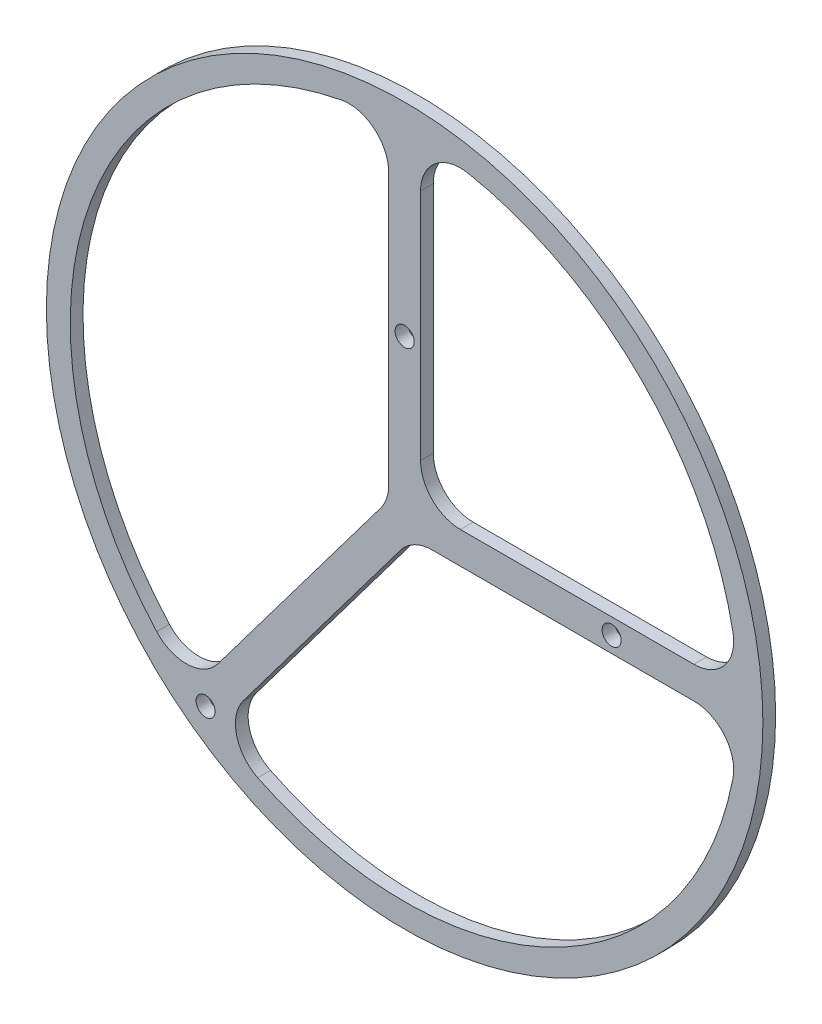
ISO-10303-21;
HEADER;
FILE_DESCRIPTION(('STEP AP214'),'2;1');
FILE_NAME('part.step','',(''),(''),'','','');
FILE_SCHEMA(('AUTOMOTIVE_DESIGN { 1 0 10303 214 1 1 1 1 }'));
ENDSEC;
DATA;
#1=APPLICATION_CONTEXT('core data for automotive mechanical design processes');
#2=APPLICATION_PROTOCOL_DEFINITION('international standard','automotive_design',2000,#1);
#3=PRODUCT_CONTEXT('',#1,'mechanical');
#4=PRODUCT('Part','Part','',(#3));
#5=PRODUCT_RELATED_PRODUCT_CATEGORY('part','',(#4));
#6=PRODUCT_DEFINITION_FORMATION('','',#4);
#7=PRODUCT_DEFINITION_CONTEXT('part definition',#1,'design');
#8=PRODUCT_DEFINITION('design','',#6,#7);
#9=PRODUCT_DEFINITION_SHAPE('','',#8);
#10=(LENGTH_UNIT() NAMED_UNIT(*) SI_UNIT(.MILLI.,.METRE.));
#11=(NAMED_UNIT(*) PLANE_ANGLE_UNIT() SI_UNIT($,.RADIAN.));
#12=(NAMED_UNIT(*) SI_UNIT($,.STERADIAN.) SOLID_ANGLE_UNIT());
#13=UNCERTAINTY_MEASURE_WITH_UNIT(LENGTH_MEASURE(1.E-05),#10,'distance_accuracy_value','');
#14=(GEOMETRIC_REPRESENTATION_CONTEXT(3) GLOBAL_UNCERTAINTY_ASSIGNED_CONTEXT((#13)) GLOBAL_UNIT_ASSIGNED_CONTEXT((#10,
#11,#12)) REPRESENTATION_CONTEXT('',''));
#15=CARTESIAN_POINT('',(0.,0.,0.));
#16=DIRECTION('',(0.,0.,1.));
#17=DIRECTION('',(1.,0.,0.));
#18=AXIS2_PLACEMENT_3D('',#15,#16,#17);
#19=CARTESIAN_POINT('',(0.,0.,1.6));
#20=DIRECTION('',(0.,0.,1.));
#21=DIRECTION('',(1.,0.,0.));
#22=AXIS2_PLACEMENT_3D('',#19,#20,#21);
#23=PLANE('',#22);
#24=DIRECTION('',(1.,0.,0.));
#25=VECTOR('',#24,1.);
#26=CARTESIAN_POINT('',(0.,2.,1.6));
#27=LINE('',#26,#25);
#28=CARTESIAN_POINT('',(7.,2.,1.6));
#29=VERTEX_POINT('',#28);
#30=CARTESIAN_POINT('',(36.3318042491699,2.,1.6));
#31=VERTEX_POINT('',#30);
#32=EDGE_CURVE('E373',#29,#31,#27,.T.);
#33=ORIENTED_EDGE('',*,*,#32,.F.);
#34=CARTESIAN_POINT('',(7.,7.,1.6));
#35=DIRECTION('',(0.,0.,1.));
#36=DIRECTION('',(1.,0.,0.));
#37=AXIS2_PLACEMENT_3D('',#34,#35,#36);
#38=CIRCLE('',#37,5.);
#39=CARTESIAN_POINT('',(2.,7.,1.6));
#40=VERTEX_POINT('',#39);
#41=EDGE_CURVE('E332',#29,#40,#38,.F.);
#42=ORIENTED_EDGE('',*,*,#41,.T.);
#43=DIRECTION('',(0.,1.,0.));
#44=VECTOR('',#43,1.);
#45=CARTESIAN_POINT('',(2.,0.,1.6));
#46=LINE('',#45,#44);
#47=CARTESIAN_POINT('',(2.,36.3318042491699,1.6));
#48=VERTEX_POINT('',#47);
#49=EDGE_CURVE('E367',#40,#48,#46,.T.);
#50=ORIENTED_EDGE('',*,*,#49,.T.);
#51=CARTESIAN_POINT('',(7.,36.3318042491699,1.6));
#52=DIRECTION('',(0.,0.,1.));
#53=DIRECTION('',(1.,0.,0.));
#54=AXIS2_PLACEMENT_3D('',#51,#52,#53);
#55=CIRCLE('',#54,5.);
#56=CARTESIAN_POINT('',(7.94594594594595,41.2415075260847,1.6));
#57=VERTEX_POINT('',#56);
#58=EDGE_CURVE('E72',#48,#57,#55,.F.);
#59=ORIENTED_EDGE('',*,*,#58,.T.);
#60=CARTESIAN_POINT('',(0.,0.,1.6));
#61=DIRECTION('',(0.,0.,1.));
#62=DIRECTION('',(1.,0.,0.));
#63=AXIS2_PLACEMENT_3D('',#60,#61,#62);
#64=CIRCLE('',#63,42.);
#65=CARTESIAN_POINT('',(41.2415075260847,7.94594594594595,1.6));
#66=VERTEX_POINT('',#65);
#67=EDGE_CURVE('E365',#66,#57,#64,.T.);
#68=ORIENTED_EDGE('',*,*,#67,.F.);
#69=CARTESIAN_POINT('',(36.3318042491699,7.,1.6));
#70=DIRECTION('',(0.,0.,1.));
#71=DIRECTION('',(1.,0.,0.));
#72=AXIS2_PLACEMENT_3D('',#69,#70,#71);
#73=CIRCLE('',#72,5.);
#74=EDGE_CURVE('E349',#66,#31,#73,.F.);
#75=ORIENTED_EDGE('',*,*,#74,.T.);
#76=EDGE_LOOP('',(#33,#42,#50,#59,#68,#75));
#77=FACE_BOUND('',#76,.T.);
#78=DIRECTION('',(0.,1.,0.));
#79=VECTOR('',#78,1.);
#80=CARTESIAN_POINT('',(-2.,0.,1.6));
#81=LINE('',#80,#79);
#82=CARTESIAN_POINT('',(-2.,2.33961256365898,1.6));
#83=VERTEX_POINT('',#82);
#84=CARTESIAN_POINT('',(-2.,36.3318042491699,1.6));
#85=VERTEX_POINT('',#84);
#86=EDGE_CURVE('E387',#83,#85,#81,.T.);
#87=ORIENTED_EDGE('',*,*,#86,.F.);
#88=CARTESIAN_POINT('',(-7.,2.33961256365898,1.6));
#89=DIRECTION('',(0.,0.,1.));
#90=DIRECTION('',(1.,0.,0.));
#91=AXIS2_PLACEMENT_3D('',#88,#89,#90);
#92=CIRCLE('',#91,5.);
#93=CARTESIAN_POINT('',(-3.0048478827538,-0.666840422845746,1.6));
#94=VERTEX_POINT('',#93);
#95=EDGE_CURVE('E326',#83,#94,#92,.F.);
#96=ORIENTED_EDGE('',*,*,#95,.T.);
#97=DIRECTION('',(-0.601290597300945,-0.799030423449241,0.));
#98=VECTOR('',#97,1.);
#99=CARTESIAN_POINT('',(-1.59806084689847,1.20258119460188,1.6));
#100=LINE('',#99,#98);
#101=CARTESIAN_POINT('',(-23.4440331249029,-27.8276357392873,1.6));
#102=VERTEX_POINT('',#101);
#103=EDGE_CURVE('E479',#94,#102,#100,.T.);
#104=ORIENTED_EDGE('',*,*,#103,.T.);
#105=CARTESIAN_POINT('',(-27.4391852421491,-24.8211827527825,1.6));
#106=DIRECTION('',(0.,0.,1.));
#107=DIRECTION('',(1.,0.,0.));
#108=AXIS2_PLACEMENT_3D('',#105,#106,#107);
#109=CIRCLE('',#108,5.);
#110=CARTESIAN_POINT('',(-31.1471832478449,-28.1753966382937,1.6));
#111=VERTEX_POINT('',#110);
#112=EDGE_CURVE('E320',#102,#111,#109,.F.);
#113=ORIENTED_EDGE('',*,*,#112,.T.);
#114=CARTESIAN_POINT('',(0.,0.,1.6));
#115=DIRECTION('',(0.,0.,1.));
#116=DIRECTION('',(1.,0.,0.));
#117=AXIS2_PLACEMENT_3D('',#114,#115,#116);
#118=CIRCLE('',#117,42.);
#119=CARTESIAN_POINT('',(-7.94594594594595,41.2415075260847,1.6));
#120=VERTEX_POINT('',#119);
#121=EDGE_CURVE('E392',#120,#111,#118,.T.);
#122=ORIENTED_EDGE('',*,*,#121,.F.);
#123=CARTESIAN_POINT('',(-7.,36.3318042491699,1.6));
#124=DIRECTION('',(0.,0.,1.));
#125=DIRECTION('',(1.,0.,0.));
#126=AXIS2_PLACEMENT_3D('',#123,#124,#125);
#127=CIRCLE('',#126,5.);
#128=EDGE_CURVE('E354',#120,#85,#127,.F.);
#129=ORIENTED_EDGE('',*,*,#128,.T.);
#130=EDGE_LOOP('',(#87,#96,#104,#113,#122,#129));
#131=FACE_BOUND('',#130,.T.);
#132=DIRECTION('',(-0.601290597300924,-0.799030423449256,0.));
#133=VECTOR('',#132,1.);
#134=CARTESIAN_POINT('',(1.59806084689766,-1.20258119460121,1.6));
#135=LINE('',#134,#133);
#136=CARTESIAN_POINT('',(-0.50221150198858,-3.99354701349538,1.6));
#137=VERTEX_POINT('',#136);
#138=CARTESIAN_POINT('',(-20.2479114311061,-30.2327981284911,1.6));
#139=VERTEX_POINT('',#138);
#140=EDGE_CURVE('E221',#137,#139,#135,.T.);
#141=ORIENTED_EDGE('',*,*,#140,.F.);
#142=CARTESIAN_POINT('',(3.4929406152577,-7.,1.6));
#143=DIRECTION('',(0.,0.,1.));
#144=DIRECTION('',(1.,0.,0.));
#145=AXIS2_PLACEMENT_3D('',#142,#143,#144);
#146=CIRCLE('',#145,5.);
#147=CARTESIAN_POINT('',(3.4929406152577,-2.,1.6));
#148=VERTEX_POINT('',#147);
#149=EDGE_CURVE('E338',#137,#148,#146,.F.);
#150=ORIENTED_EDGE('',*,*,#149,.T.);
#151=DIRECTION('',(1.,0.,0.));
#152=VECTOR('',#151,1.);
#153=CARTESIAN_POINT('',(0.,-2.,1.6));
#154=LINE('',#153,#152);
#155=CARTESIAN_POINT('',(36.3318042491699,-2.,1.6));
#156=VERTEX_POINT('',#155);
#157=EDGE_CURVE('E220',#148,#156,#154,.T.);
#158=ORIENTED_EDGE('',*,*,#157,.T.);
#159=CARTESIAN_POINT('',(36.3318042491699,-7.,1.6));
#160=DIRECTION('',(0.,0.,1.));
#161=DIRECTION('',(1.,0.,0.));
#162=AXIS2_PLACEMENT_3D('',#159,#160,#161);
#163=CIRCLE('',#162,5.);
#164=CARTESIAN_POINT('',(41.2415075260847,-7.94594594594595,1.6));
#165=VERTEX_POINT('',#164);
#166=EDGE_CURVE('E218',#156,#165,#163,.F.);
#167=ORIENTED_EDGE('',*,*,#166,.T.);
#168=CARTESIAN_POINT('',(0.,0.,1.6));
#169=DIRECTION('',(0.,0.,1.));
#170=DIRECTION('',(1.,0.,0.));
#171=AXIS2_PLACEMENT_3D('',#168,#169,#170);
#172=CIRCLE('',#171,42.);
#173=CARTESIAN_POINT('',(-18.4490781400571,-37.7310418062113,1.6));
#174=VERTEX_POINT('',#173);
#175=EDGE_CURVE('E208',#174,#165,#172,.T.);
#176=ORIENTED_EDGE('',*,*,#175,.F.);
#177=CARTESIAN_POINT('',(-16.2527593138598,-33.2392511149957,1.6));
#178=DIRECTION('',(0.,0.,1.));
#179=DIRECTION('',(1.,0.,0.));
#180=AXIS2_PLACEMENT_3D('',#177,#178,#179);
#181=CIRCLE('',#180,5.);
#182=EDGE_CURVE('E190',#174,#139,#181,.F.);
#183=ORIENTED_EDGE('',*,*,#182,.T.);
#184=EDGE_LOOP('',(#141,#150,#158,#167,#176,#183));
#185=FACE_BOUND('',#184,.T.);
#186=CARTESIAN_POINT('',(0.,0.,1.6));
#187=DIRECTION('',(0.,0.,1.));
#188=DIRECTION('',(1.,0.,0.));
#189=AXIS2_PLACEMENT_3D('',#186,#187,#188);
#190=CIRCLE('',#189,45.);
#191=CARTESIAN_POINT('',(45.,0.,1.6));
#192=VERTEX_POINT('',#191);
#193=EDGE_CURVE('E257',#192,#192,#190,.T.);
#194=ORIENTED_EDGE('',*,*,#193,.T.);
#195=EDGE_LOOP('',(#194));
#196=FACE_BOUND('',#195,.T.);
#197=CARTESIAN_POINT('',(-25.,-33.2214750669603,1.6));
#198=DIRECTION('',(0.,0.,1.));
#199=DIRECTION('',(1.,0.,0.));
#200=AXIS2_PLACEMENT_3D('',#197,#198,#199);
#201=CIRCLE('',#200,1.2);
#202=CARTESIAN_POINT('',(-23.8,-33.2214750669603,1.6));
#203=VERTEX_POINT('',#202);
#204=EDGE_CURVE('E252',#203,#203,#201,.F.);
#205=ORIENTED_EDGE('',*,*,#204,.T.);
#206=EDGE_LOOP('',(#205));
#207=FACE_BOUND('',#206,.T.);
#208=CARTESIAN_POINT('',(0.,19.5,1.6));
#209=DIRECTION('',(0.,0.,1.));
#210=DIRECTION('',(1.,0.,0.));
#211=AXIS2_PLACEMENT_3D('',#208,#209,#210);
#212=CIRCLE('',#211,1.2);
#213=CARTESIAN_POINT('',(1.2,19.5,1.6));
#214=VERTEX_POINT('',#213);
#215=EDGE_CURVE('E244',#214,#214,#212,.F.);
#216=ORIENTED_EDGE('',*,*,#215,.T.);
#217=EDGE_LOOP('',(#216));
#218=FACE_BOUND('',#217,.T.);
#219=CARTESIAN_POINT('',(26.,0.,1.6));
#220=DIRECTION('',(0.,0.,1.));
#221=DIRECTION('',(1.,0.,0.));
#222=AXIS2_PLACEMENT_3D('',#219,#220,#221);
#223=CIRCLE('',#222,1.2);
#224=CARTESIAN_POINT('',(27.2,0.,1.6));
#225=VERTEX_POINT('',#224);
#226=EDGE_CURVE('E235',#225,#225,#223,.F.);
#227=ORIENTED_EDGE('',*,*,#226,.T.);
#228=EDGE_LOOP('',(#227));
#229=FACE_BOUND('',#228,.T.);
#230=ADVANCED_FACE('F63',(#77,#131,#185,#196,#207,#218,#229),#23,.T.);
#231=CARTESIAN_POINT('',(0.,0.,1.6));
#232=DIRECTION('',(0.,0.,-1.));
#233=DIRECTION('',(-1.,0.,0.));
#234=AXIS2_PLACEMENT_3D('',#231,#232,#233);
#235=CYLINDRICAL_SURFACE('',#234,45.);
#236=ORIENTED_EDGE('',*,*,#193,.F.);
#237=EDGE_LOOP('',(#236));
#238=FACE_BOUND('',#237,.T.);
#239=CARTESIAN_POINT('',(0.,0.,0.));
#240=DIRECTION('',(0.,0.,1.));
#241=DIRECTION('',(1.,0.,0.));
#242=AXIS2_PLACEMENT_3D('',#239,#240,#241);
#243=CIRCLE('',#242,45.);
#244=CARTESIAN_POINT('',(45.,0.,0.));
#245=VERTEX_POINT('',#244);
#246=EDGE_CURVE('E256',#245,#245,#243,.T.);
#247=ORIENTED_EDGE('',*,*,#246,.T.);
#248=EDGE_LOOP('',(#247));
#249=FACE_BOUND('',#248,.T.);
#250=ADVANCED_FACE('F440',(#238,#249),#235,.T.);
#251=CARTESIAN_POINT('',(0.,0.,0.));
#252=DIRECTION('',(0.,0.,1.));
#253=DIRECTION('',(1.,0.,0.));
#254=AXIS2_PLACEMENT_3D('',#251,#252,#253);
#255=PLANE('',#254);
#256=DIRECTION('',(0.,1.,0.));
#257=VECTOR('',#256,1.);
#258=CARTESIAN_POINT('',(2.,0.,0.));
#259=LINE('',#258,#257);
#260=CARTESIAN_POINT('',(2.,7.,0.));
#261=VERTEX_POINT('',#260);
#262=CARTESIAN_POINT('',(2.,36.3318042491699,0.));
#263=VERTEX_POINT('',#262);
#264=EDGE_CURVE('E380',#261,#263,#259,.T.);
#265=ORIENTED_EDGE('',*,*,#264,.F.);
#266=CARTESIAN_POINT('',(7.,7.,0.));
#267=DIRECTION('',(0.,0.,1.));
#268=DIRECTION('',(1.,0.,0.));
#269=AXIS2_PLACEMENT_3D('',#266,#267,#268);
#270=CIRCLE('',#269,5.);
#271=CARTESIAN_POINT('',(7.,2.,0.));
#272=VERTEX_POINT('',#271);
#273=EDGE_CURVE('E335',#261,#272,#270,.T.);
#274=ORIENTED_EDGE('',*,*,#273,.T.);
#275=DIRECTION('',(1.,0.,0.));
#276=VECTOR('',#275,1.);
#277=CARTESIAN_POINT('',(0.,2.,0.));
#278=LINE('',#277,#276);
#279=CARTESIAN_POINT('',(36.3318042491699,2.,0.));
#280=VERTEX_POINT('',#279);
#281=EDGE_CURVE('E394',#272,#280,#278,.T.);
#282=ORIENTED_EDGE('',*,*,#281,.T.);
#283=CARTESIAN_POINT('',(36.3318042491699,7.,0.));
#284=DIRECTION('',(0.,0.,1.));
#285=DIRECTION('',(1.,0.,0.));
#286=AXIS2_PLACEMENT_3D('',#283,#284,#285);
#287=CIRCLE('',#286,5.);
#288=CARTESIAN_POINT('',(41.2415075260847,7.94594594594595,0.));
#289=VERTEX_POINT('',#288);
#290=EDGE_CURVE('E86',#280,#289,#287,.T.);
#291=ORIENTED_EDGE('',*,*,#290,.T.);
#292=CARTESIAN_POINT('',(0.,0.,0.));
#293=DIRECTION('',(0.,0.,1.));
#294=DIRECTION('',(1.,0.,0.));
#295=AXIS2_PLACEMENT_3D('',#292,#293,#294);
#296=CIRCLE('',#295,42.);
#297=CARTESIAN_POINT('',(7.94594594594595,41.2415075260847,0.));
#298=VERTEX_POINT('',#297);
#299=EDGE_CURVE('E382',#289,#298,#296,.T.);
#300=ORIENTED_EDGE('',*,*,#299,.T.);
#301=CARTESIAN_POINT('',(7.,36.3318042491699,0.));
#302=DIRECTION('',(0.,0.,1.));
#303=DIRECTION('',(1.,0.,0.));
#304=AXIS2_PLACEMENT_3D('',#301,#302,#303);
#305=CIRCLE('',#304,5.);
#306=EDGE_CURVE('E12',#298,#263,#305,.T.);
#307=ORIENTED_EDGE('',*,*,#306,.T.);
#308=EDGE_LOOP('',(#265,#274,#282,#291,#300,#307));
#309=FACE_BOUND('',#308,.T.);
#310=DIRECTION('',(-0.601290597300945,-0.799030423449241,0.));
#311=VECTOR('',#310,1.);
#312=CARTESIAN_POINT('',(-1.59806084689847,1.20258119460188,0.));
#313=LINE('',#312,#311);
#314=CARTESIAN_POINT('',(-3.0048478827538,-0.666840422845746,0.));
#315=VERTEX_POINT('',#314);
#316=CARTESIAN_POINT('',(-23.4440331249029,-27.8276357392873,0.));
#317=VERTEX_POINT('',#316);
#318=EDGE_CURVE('E227',#315,#317,#313,.T.);
#319=ORIENTED_EDGE('',*,*,#318,.F.);
#320=CARTESIAN_POINT('',(-7.,2.33961256365898,0.));
#321=DIRECTION('',(0.,0.,1.));
#322=DIRECTION('',(1.,0.,0.));
#323=AXIS2_PLACEMENT_3D('',#320,#321,#322);
#324=CIRCLE('',#323,5.);
#325=CARTESIAN_POINT('',(-2.,2.33961256365898,0.));
#326=VERTEX_POINT('',#325);
#327=EDGE_CURVE('E329',#315,#326,#324,.T.);
#328=ORIENTED_EDGE('',*,*,#327,.T.);
#329=DIRECTION('',(0.,1.,0.));
#330=VECTOR('',#329,1.);
#331=CARTESIAN_POINT('',(-2.,0.,0.));
#332=LINE('',#331,#330);
#333=CARTESIAN_POINT('',(-2.,36.3318042491699,0.));
#334=VERTEX_POINT('',#333);
#335=EDGE_CURVE('E470',#326,#334,#332,.T.);
#336=ORIENTED_EDGE('',*,*,#335,.T.);
#337=CARTESIAN_POINT('',(-7.,36.3318042491699,0.));
#338=DIRECTION('',(0.,0.,1.));
#339=DIRECTION('',(1.,0.,0.));
#340=AXIS2_PLACEMENT_3D('',#337,#338,#339);
#341=CIRCLE('',#340,5.);
#342=CARTESIAN_POINT('',(-7.94594594594595,41.2415075260847,0.));
#343=VERTEX_POINT('',#342);
#344=EDGE_CURVE('E357',#334,#343,#341,.T.);
#345=ORIENTED_EDGE('',*,*,#344,.T.);
#346=CARTESIAN_POINT('',(0.,0.,0.));
#347=DIRECTION('',(0.,0.,1.));
#348=DIRECTION('',(1.,0.,0.));
#349=AXIS2_PLACEMENT_3D('',#346,#347,#348);
#350=CIRCLE('',#349,42.);
#351=CARTESIAN_POINT('',(-31.1471832478449,-28.1753966382937,0.));
#352=VERTEX_POINT('',#351);
#353=EDGE_CURVE('E478',#343,#352,#350,.T.);
#354=ORIENTED_EDGE('',*,*,#353,.T.);
#355=CARTESIAN_POINT('',(-27.4391852421491,-24.8211827527825,0.));
#356=DIRECTION('',(0.,0.,1.));
#357=DIRECTION('',(1.,0.,0.));
#358=AXIS2_PLACEMENT_3D('',#355,#356,#357);
#359=CIRCLE('',#358,5.);
#360=EDGE_CURVE('E323',#352,#317,#359,.T.);
#361=ORIENTED_EDGE('',*,*,#360,.T.);
#362=EDGE_LOOP('',(#319,#328,#336,#345,#354,#361));
#363=FACE_BOUND('',#362,.T.);
#364=DIRECTION('',(1.,0.,0.));
#365=VECTOR('',#364,1.);
#366=CARTESIAN_POINT('',(0.,-2.,0.));
#367=LINE('',#366,#365);
#368=CARTESIAN_POINT('',(3.4929406152577,-2.,0.));
#369=VERTEX_POINT('',#368);
#370=CARTESIAN_POINT('',(36.3318042491699,-2.,0.));
#371=VERTEX_POINT('',#370);
#372=EDGE_CURVE('E236',#369,#371,#367,.T.);
#373=ORIENTED_EDGE('',*,*,#372,.F.);
#374=CARTESIAN_POINT('',(3.4929406152577,-7.,0.));
#375=DIRECTION('',(0.,0.,1.));
#376=DIRECTION('',(1.,0.,0.));
#377=AXIS2_PLACEMENT_3D('',#374,#375,#376);
#378=CIRCLE('',#377,5.);
#379=CARTESIAN_POINT('',(-0.50221150198858,-3.99354701349538,0.));
#380=VERTEX_POINT('',#379);
#381=EDGE_CURVE('E341',#369,#380,#378,.T.);
#382=ORIENTED_EDGE('',*,*,#381,.T.);
#383=DIRECTION('',(-0.601290597300924,-0.799030423449256,0.));
#384=VECTOR('',#383,1.);
#385=CARTESIAN_POINT('',(1.59806084689766,-1.20258119460121,0.));
#386=LINE('',#385,#384);
#387=CARTESIAN_POINT('',(-20.2479114311061,-30.2327981284911,0.));
#388=VERTEX_POINT('',#387);
#389=EDGE_CURVE('E225',#380,#388,#386,.T.);
#390=ORIENTED_EDGE('',*,*,#389,.T.);
#391=CARTESIAN_POINT('',(-16.2527593138598,-33.2392511149957,0.));
#392=DIRECTION('',(0.,0.,1.));
#393=DIRECTION('',(1.,0.,0.));
#394=AXIS2_PLACEMENT_3D('',#391,#392,#393);
#395=CIRCLE('',#394,5.);
#396=CARTESIAN_POINT('',(-18.4490781400571,-37.7310418062113,0.));
#397=VERTEX_POINT('',#396);
#398=EDGE_CURVE('E201',#388,#397,#395,.T.);
#399=ORIENTED_EDGE('',*,*,#398,.T.);
#400=CARTESIAN_POINT('',(0.,0.,0.));
#401=DIRECTION('',(0.,0.,1.));
#402=DIRECTION('',(1.,0.,0.));
#403=AXIS2_PLACEMENT_3D('',#400,#401,#402);
#404=CIRCLE('',#403,42.);
#405=CARTESIAN_POINT('',(41.2415075260847,-7.94594594594595,0.));
#406=VERTEX_POINT('',#405);
#407=EDGE_CURVE('E211',#397,#406,#404,.T.);
#408=ORIENTED_EDGE('',*,*,#407,.T.);
#409=CARTESIAN_POINT('',(36.3318042491699,-7.,0.));
#410=DIRECTION('',(0.,0.,1.));
#411=DIRECTION('',(1.,0.,0.));
#412=AXIS2_PLACEMENT_3D('',#409,#410,#411);
#413=CIRCLE('',#412,5.);
#414=EDGE_CURVE('E346',#406,#371,#413,.T.);
#415=ORIENTED_EDGE('',*,*,#414,.T.);
#416=EDGE_LOOP('',(#373,#382,#390,#399,#408,#415));
#417=FACE_BOUND('',#416,.T.);
#418=CARTESIAN_POINT('',(26.,0.,0.));
#419=DIRECTION('',(0.,0.,-1.));
#420=DIRECTION('',(-1.,0.,0.));
#421=AXIS2_PLACEMENT_3D('',#418,#419,#420);
#422=CIRCLE('',#421,1.2);
#423=CARTESIAN_POINT('',(24.8,0.,0.));
#424=VERTEX_POINT('',#423);
#425=EDGE_CURVE('E231',#424,#424,#422,.T.);
#426=ORIENTED_EDGE('',*,*,#425,.F.);
#427=EDGE_LOOP('',(#426));
#428=FACE_BOUND('',#427,.T.);
#429=CARTESIAN_POINT('',(0.,19.5,0.));
#430=DIRECTION('',(0.,0.,-1.));
#431=DIRECTION('',(-1.,0.,0.));
#432=AXIS2_PLACEMENT_3D('',#429,#430,#431);
#433=CIRCLE('',#432,1.2);
#434=CARTESIAN_POINT('',(-1.2,19.5,0.));
#435=VERTEX_POINT('',#434);
#436=EDGE_CURVE('E240',#435,#435,#433,.T.);
#437=ORIENTED_EDGE('',*,*,#436,.F.);
#438=EDGE_LOOP('',(#437));
#439=FACE_BOUND('',#438,.T.);
#440=CARTESIAN_POINT('',(-25.,-33.2214750669603,0.));
#441=DIRECTION('',(0.,0.,-1.));
#442=DIRECTION('',(-1.,0.,0.));
#443=AXIS2_PLACEMENT_3D('',#440,#441,#442);
#444=CIRCLE('',#443,1.2);
#445=CARTESIAN_POINT('',(-26.2,-33.2214750669603,0.));
#446=VERTEX_POINT('',#445);
#447=EDGE_CURVE('E248',#446,#446,#444,.T.);
#448=ORIENTED_EDGE('',*,*,#447,.F.);
#449=EDGE_LOOP('',(#448));
#450=FACE_BOUND('',#449,.T.);
#451=ORIENTED_EDGE('',*,*,#246,.F.);
#452=EDGE_LOOP('',(#451));
#453=FACE_BOUND('',#452,.T.);
#454=ADVANCED_FACE('F378',(#309,#363,#417,#428,#439,#450,#453),#255,.F.);
#455=CARTESIAN_POINT('',(-25.,-33.2214750669603,0.));
#456=DIRECTION('',(0.,0.,-1.));
#457=DIRECTION('',(-1.,0.,0.));
#458=AXIS2_PLACEMENT_3D('',#455,#456,#457);
#459=CYLINDRICAL_SURFACE('',#458,1.2);
#460=ORIENTED_EDGE('',*,*,#204,.F.);
#461=EDGE_LOOP('',(#460));
#462=FACE_BOUND('',#461,.T.);
#463=ORIENTED_EDGE('',*,*,#447,.T.);
#464=EDGE_LOOP('',(#463));
#465=FACE_BOUND('',#464,.T.);
#466=ADVANCED_FACE('F451',(#462,#465),#459,.F.);
#467=CARTESIAN_POINT('',(0.,19.5,0.));
#468=DIRECTION('',(0.,0.,-1.));
#469=DIRECTION('',(-1.,0.,0.));
#470=AXIS2_PLACEMENT_3D('',#467,#468,#469);
#471=CYLINDRICAL_SURFACE('',#470,1.2);
#472=ORIENTED_EDGE('',*,*,#215,.F.);
#473=EDGE_LOOP('',(#472));
#474=FACE_BOUND('',#473,.T.);
#475=ORIENTED_EDGE('',*,*,#436,.T.);
#476=EDGE_LOOP('',(#475));
#477=FACE_BOUND('',#476,.T.);
#478=ADVANCED_FACE('F519',(#474,#477),#471,.F.);
#479=CARTESIAN_POINT('',(26.,0.,0.));
#480=DIRECTION('',(0.,0.,-1.));
#481=DIRECTION('',(-1.,0.,0.));
#482=AXIS2_PLACEMENT_3D('',#479,#480,#481);
#483=CYLINDRICAL_SURFACE('',#482,1.2);
#484=ORIENTED_EDGE('',*,*,#226,.F.);
#485=EDGE_LOOP('',(#484));
#486=FACE_BOUND('',#485,.T.);
#487=ORIENTED_EDGE('',*,*,#425,.T.);
#488=EDGE_LOOP('',(#487));
#489=FACE_BOUND('',#488,.T.);
#490=ADVANCED_FACE('F518',(#486,#489),#483,.F.);
#491=CARTESIAN_POINT('',(1.59806084689766,-1.20258119460121,0.));
#492=DIRECTION('',(-0.799030423449256,0.601290597300924,0.));
#493=DIRECTION('',(-0.601290597300924,-0.799030423449256,0.));
#494=AXIS2_PLACEMENT_3D('',#491,#492,#493);
#495=PLANE('',#494);
#496=ORIENTED_EDGE('',*,*,#140,.T.);
#497=DIRECTION('',(0.,0.,-1.));
#498=VECTOR('',#497,1.);
#499=CARTESIAN_POINT('',(-20.2479114311061,-30.2327981284911,0.));
#500=LINE('',#499,#498);
#501=EDGE_CURVE('E195',#139,#388,#500,.T.);
#502=ORIENTED_EDGE('',*,*,#501,.T.);
#503=ORIENTED_EDGE('',*,*,#389,.F.);
#504=DIRECTION('',(0.,0.,1.));
#505=VECTOR('',#504,1.);
#506=CARTESIAN_POINT('',(-0.50221150198858,-3.99354701349538,0.));
#507=LINE('',#506,#505);
#508=EDGE_CURVE('E213',#380,#137,#507,.T.);
#509=ORIENTED_EDGE('',*,*,#508,.T.);
#510=EDGE_LOOP('',(#496,#502,#503,#509));
#511=FACE_BOUND('',#510,.T.);
#512=ADVANCED_FACE('F424',(#511),#495,.F.);
#513=CARTESIAN_POINT('',(0.,-2.,0.));
#514=DIRECTION('',(0.,-1.,0.));
#515=DIRECTION('',(0.,0.,-1.));
#516=AXIS2_PLACEMENT_3D('',#513,#514,#515);
#517=PLANE('',#516);
#518=ORIENTED_EDGE('',*,*,#157,.F.);
#519=DIRECTION('',(0.,0.,1.));
#520=VECTOR('',#519,1.);
#521=CARTESIAN_POINT('',(3.4929406152577,-2.,0.));
#522=LINE('',#521,#520);
#523=EDGE_CURVE('E310',#148,#369,#522,.F.);
#524=ORIENTED_EDGE('',*,*,#523,.T.);
#525=ORIENTED_EDGE('',*,*,#372,.T.);
#526=DIRECTION('',(0.,0.,1.));
#527=VECTOR('',#526,1.);
#528=CARTESIAN_POINT('',(36.3318042491699,-2.,0.));
#529=LINE('',#528,#527);
#530=EDGE_CURVE('E306',#371,#156,#529,.T.);
#531=ORIENTED_EDGE('',*,*,#530,.T.);
#532=EDGE_LOOP('',(#518,#524,#525,#531));
#533=FACE_BOUND('',#532,.T.);
#534=ADVANCED_FACE('F413',(#533),#517,.T.);
#535=CARTESIAN_POINT('',(0.,0.,0.));
#536=DIRECTION('',(0.,0.,1.));
#537=DIRECTION('',(1.,0.,0.));
#538=AXIS2_PLACEMENT_3D('',#535,#536,#537);
#539=CYLINDRICAL_SURFACE('',#538,42.);
#540=ORIENTED_EDGE('',*,*,#407,.F.);
#541=DIRECTION('',(0.,0.,1.));
#542=VECTOR('',#541,1.);
#543=CARTESIAN_POINT('',(-18.4490781400571,-37.7310418062113,0.));
#544=LINE('',#543,#542);
#545=EDGE_CURVE('E194',#397,#174,#544,.T.);
#546=ORIENTED_EDGE('',*,*,#545,.T.);
#547=ORIENTED_EDGE('',*,*,#175,.T.);
#548=DIRECTION('',(0.,0.,1.));
#549=VECTOR('',#548,1.);
#550=CARTESIAN_POINT('',(41.2415075260847,-7.94594594594595,0.));
#551=LINE('',#550,#549);
#552=EDGE_CURVE('E214',#165,#406,#551,.F.);
#553=ORIENTED_EDGE('',*,*,#552,.T.);
#554=EDGE_LOOP('',(#540,#546,#547,#553));
#555=FACE_BOUND('',#554,.T.);
#556=ADVANCED_FACE('F207',(#555),#539,.F.);
#557=CARTESIAN_POINT('',(-2.,0.,0.));
#558=DIRECTION('',(1.,0.,0.));
#559=DIRECTION('',(0.,0.,-1.));
#560=AXIS2_PLACEMENT_3D('',#557,#558,#559);
#561=PLANE('',#560);
#562=ORIENTED_EDGE('',*,*,#335,.F.);
#563=DIRECTION('',(0.,0.,1.));
#564=VECTOR('',#563,1.);
#565=CARTESIAN_POINT('',(-2.,2.33961256365898,0.));
#566=LINE('',#565,#564);
#567=EDGE_CURVE('E288',#326,#83,#566,.T.);
#568=ORIENTED_EDGE('',*,*,#567,.T.);
#569=ORIENTED_EDGE('',*,*,#86,.T.);
#570=DIRECTION('',(0.,0.,-1.));
#571=VECTOR('',#570,1.);
#572=CARTESIAN_POINT('',(-2.,36.3318042491699,0.));
#573=LINE('',#572,#571);
#574=EDGE_CURVE('E285',#85,#334,#573,.T.);
#575=ORIENTED_EDGE('',*,*,#574,.T.);
#576=EDGE_LOOP('',(#562,#568,#569,#575));
#577=FACE_BOUND('',#576,.T.);
#578=ADVANCED_FACE('F474',(#577),#561,.F.);
#579=CARTESIAN_POINT('',(-1.59806084689847,1.20258119460188,0.));
#580=DIRECTION('',(-0.79903042344924,0.601290597300945,0.));
#581=DIRECTION('',(-0.601290597300945,-0.799030423449241,0.));
#582=AXIS2_PLACEMENT_3D('',#579,#580,#581);
#583=PLANE('',#582);
#584=ORIENTED_EDGE('',*,*,#318,.T.);
#585=DIRECTION('',(0.,0.,1.));
#586=VECTOR('',#585,1.);
#587=CARTESIAN_POINT('',(-23.4440331249029,-27.8276357392873,0.));
#588=LINE('',#587,#586);
#589=EDGE_CURVE('E274',#317,#102,#588,.T.);
#590=ORIENTED_EDGE('',*,*,#589,.T.);
#591=ORIENTED_EDGE('',*,*,#103,.F.);
#592=DIRECTION('',(0.,0.,1.));
#593=VECTOR('',#592,1.);
#594=CARTESIAN_POINT('',(-3.0048478827538,-0.666840422845745,0.));
#595=LINE('',#594,#593);
#596=EDGE_CURVE('E271',#94,#315,#595,.F.);
#597=ORIENTED_EDGE('',*,*,#596,.T.);
#598=EDGE_LOOP('',(#584,#590,#591,#597));
#599=FACE_BOUND('',#598,.T.);
#600=ADVANCED_FACE('F507',(#599),#583,.T.);
#601=CARTESIAN_POINT('',(0.,0.,0.));
#602=DIRECTION('',(0.,0.,1.));
#603=DIRECTION('',(1.,0.,0.));
#604=AXIS2_PLACEMENT_3D('',#601,#602,#603);
#605=CYLINDRICAL_SURFACE('',#604,42.);
#606=ORIENTED_EDGE('',*,*,#121,.T.);
#607=DIRECTION('',(0.,0.,1.));
#608=VECTOR('',#607,1.);
#609=CARTESIAN_POINT('',(-31.1471832478449,-28.1753966382937,0.));
#610=LINE('',#609,#608);
#611=EDGE_CURVE('E282',#111,#352,#610,.F.);
#612=ORIENTED_EDGE('',*,*,#611,.T.);
#613=ORIENTED_EDGE('',*,*,#353,.F.);
#614=DIRECTION('',(0.,0.,1.));
#615=VECTOR('',#614,1.);
#616=CARTESIAN_POINT('',(-7.94594594594595,41.2415075260847,0.));
#617=LINE('',#616,#615);
#618=EDGE_CURVE('E278',#343,#120,#617,.T.);
#619=ORIENTED_EDGE('',*,*,#618,.T.);
#620=EDGE_LOOP('',(#606,#612,#613,#619));
#621=FACE_BOUND('',#620,.T.);
#622=ADVANCED_FACE('F500',(#621),#605,.F.);
#623=CARTESIAN_POINT('',(0.,2.,0.));
#624=DIRECTION('',(0.,-1.,0.));
#625=DIRECTION('',(0.,0.,-1.));
#626=AXIS2_PLACEMENT_3D('',#623,#624,#625);
#627=PLANE('',#626);
#628=ORIENTED_EDGE('',*,*,#281,.F.);
#629=DIRECTION('',(0.,0.,1.));
#630=VECTOR('',#629,1.);
#631=CARTESIAN_POINT('',(7.,2.,0.));
#632=LINE('',#631,#630);
#633=EDGE_CURVE('E295',#272,#29,#632,.T.);
#634=ORIENTED_EDGE('',*,*,#633,.T.);
#635=ORIENTED_EDGE('',*,*,#32,.T.);
#636=DIRECTION('',(0.,0.,-1.));
#637=VECTOR('',#636,1.);
#638=CARTESIAN_POINT('',(36.3318042491699,2.,0.));
#639=LINE('',#638,#637);
#640=EDGE_CURVE('E292',#31,#280,#639,.T.);
#641=ORIENTED_EDGE('',*,*,#640,.T.);
#642=EDGE_LOOP('',(#628,#634,#635,#641));
#643=FACE_BOUND('',#642,.T.);
#644=ADVANCED_FACE('F498',(#643),#627,.F.);
#645=CARTESIAN_POINT('',(2.,0.,0.));
#646=DIRECTION('',(1.,0.,0.));
#647=DIRECTION('',(0.,0.,-1.));
#648=AXIS2_PLACEMENT_3D('',#645,#646,#647);
#649=PLANE('',#648);
#650=ORIENTED_EDGE('',*,*,#49,.F.);
#651=DIRECTION('',(0.,0.,1.));
#652=VECTOR('',#651,1.);
#653=CARTESIAN_POINT('',(2.,7.,0.));
#654=LINE('',#653,#652);
#655=EDGE_CURVE('E303',#40,#261,#654,.F.);
#656=ORIENTED_EDGE('',*,*,#655,.T.);
#657=ORIENTED_EDGE('',*,*,#264,.T.);
#658=DIRECTION('',(0.,0.,1.));
#659=VECTOR('',#658,1.);
#660=CARTESIAN_POINT('',(2.,36.3318042491699,0.));
#661=LINE('',#660,#659);
#662=EDGE_CURVE('E299',#263,#48,#661,.T.);
#663=ORIENTED_EDGE('',*,*,#662,.T.);
#664=EDGE_LOOP('',(#650,#656,#657,#663));
#665=FACE_BOUND('',#664,.T.);
#666=ADVANCED_FACE('F384',(#665),#649,.T.);
#667=CARTESIAN_POINT('',(0.,0.,0.));
#668=DIRECTION('',(0.,0.,1.));
#669=DIRECTION('',(1.,0.,0.));
#670=AXIS2_PLACEMENT_3D('',#667,#668,#669);
#671=CYLINDRICAL_SURFACE('',#670,42.);
#672=ORIENTED_EDGE('',*,*,#299,.F.);
#673=DIRECTION('',(0.,0.,1.));
#674=VECTOR('',#673,1.);
#675=CARTESIAN_POINT('',(41.2415075260847,7.94594594594595,0.));
#676=LINE('',#675,#674);
#677=EDGE_CURVE('E202',#289,#66,#676,.T.);
#678=ORIENTED_EDGE('',*,*,#677,.T.);
#679=ORIENTED_EDGE('',*,*,#67,.T.);
#680=DIRECTION('',(0.,0.,1.));
#681=VECTOR('',#680,1.);
#682=CARTESIAN_POINT('',(7.94594594594595,41.2415075260847,0.));
#683=LINE('',#682,#681);
#684=EDGE_CURVE('E79',#57,#298,#683,.F.);
#685=ORIENTED_EDGE('',*,*,#684,.T.);
#686=EDGE_LOOP('',(#672,#678,#679,#685));
#687=FACE_BOUND('',#686,.T.);
#688=ADVANCED_FACE('F370',(#687),#671,.F.);
#689=CARTESIAN_POINT('',(-16.2527593138598,-33.2392511149957,0.));
#690=DIRECTION('',(0.,0.,1.));
#691=DIRECTION('',(1.,0.,0.));
#692=AXIS2_PLACEMENT_3D('',#689,#690,#691);
#693=CYLINDRICAL_SURFACE('',#692,5.);
#694=ORIENTED_EDGE('',*,*,#398,.F.);
#695=ORIENTED_EDGE('',*,*,#501,.F.);
#696=ORIENTED_EDGE('',*,*,#182,.F.);
#697=ORIENTED_EDGE('',*,*,#545,.F.);
#698=EDGE_LOOP('',(#694,#695,#696,#697));
#699=FACE_BOUND('',#698,.T.);
#700=ADVANCED_FACE('F193',(#699),#693,.F.);
#701=CARTESIAN_POINT('',(-27.4391852421491,-24.8211827527825,0.));
#702=DIRECTION('',(0.,0.,1.));
#703=DIRECTION('',(1.,0.,0.));
#704=AXIS2_PLACEMENT_3D('',#701,#702,#703);
#705=CYLINDRICAL_SURFACE('',#704,5.);
#706=ORIENTED_EDGE('',*,*,#360,.F.);
#707=ORIENTED_EDGE('',*,*,#611,.F.);
#708=ORIENTED_EDGE('',*,*,#112,.F.);
#709=ORIENTED_EDGE('',*,*,#589,.F.);
#710=EDGE_LOOP('',(#706,#707,#708,#709));
#711=FACE_BOUND('',#710,.T.);
#712=ADVANCED_FACE('F456',(#711),#705,.F.);
#713=CARTESIAN_POINT('',(-7.,2.33961256365898,0.));
#714=DIRECTION('',(0.,0.,1.));
#715=DIRECTION('',(1.,0.,0.));
#716=AXIS2_PLACEMENT_3D('',#713,#714,#715);
#717=CYLINDRICAL_SURFACE('',#716,5.);
#718=ORIENTED_EDGE('',*,*,#327,.F.);
#719=ORIENTED_EDGE('',*,*,#596,.F.);
#720=ORIENTED_EDGE('',*,*,#95,.F.);
#721=ORIENTED_EDGE('',*,*,#567,.F.);
#722=EDGE_LOOP('',(#718,#719,#720,#721));
#723=FACE_BOUND('',#722,.T.);
#724=ADVANCED_FACE('F436',(#723),#717,.F.);
#725=CARTESIAN_POINT('',(7.,7.,0.));
#726=DIRECTION('',(0.,0.,1.));
#727=DIRECTION('',(1.,0.,0.));
#728=AXIS2_PLACEMENT_3D('',#725,#726,#727);
#729=CYLINDRICAL_SURFACE('',#728,5.);
#730=ORIENTED_EDGE('',*,*,#273,.F.);
#731=ORIENTED_EDGE('',*,*,#655,.F.);
#732=ORIENTED_EDGE('',*,*,#41,.F.);
#733=ORIENTED_EDGE('',*,*,#633,.F.);
#734=EDGE_LOOP('',(#730,#731,#732,#733));
#735=FACE_BOUND('',#734,.T.);
#736=ADVANCED_FACE('F428',(#735),#729,.F.);
#737=CARTESIAN_POINT('',(3.4929406152577,-7.,0.));
#738=DIRECTION('',(0.,0.,1.));
#739=DIRECTION('',(1.,0.,0.));
#740=AXIS2_PLACEMENT_3D('',#737,#738,#739);
#741=CYLINDRICAL_SURFACE('',#740,5.);
#742=ORIENTED_EDGE('',*,*,#381,.F.);
#743=ORIENTED_EDGE('',*,*,#523,.F.);
#744=ORIENTED_EDGE('',*,*,#149,.F.);
#745=ORIENTED_EDGE('',*,*,#508,.F.);
#746=EDGE_LOOP('',(#742,#743,#744,#745));
#747=FACE_BOUND('',#746,.T.);
#748=ADVANCED_FACE('F426',(#747),#741,.F.);
#749=CARTESIAN_POINT('',(36.3318042491699,-7.,0.));
#750=DIRECTION('',(0.,0.,1.));
#751=DIRECTION('',(1.,0.,0.));
#752=AXIS2_PLACEMENT_3D('',#749,#750,#751);
#753=CYLINDRICAL_SURFACE('',#752,5.);
#754=ORIENTED_EDGE('',*,*,#414,.F.);
#755=ORIENTED_EDGE('',*,*,#552,.F.);
#756=ORIENTED_EDGE('',*,*,#166,.F.);
#757=ORIENTED_EDGE('',*,*,#530,.F.);
#758=EDGE_LOOP('',(#754,#755,#756,#757));
#759=FACE_BOUND('',#758,.T.);
#760=ADVANCED_FACE('F419',(#759),#753,.F.);
#761=CARTESIAN_POINT('',(36.3318042491699,7.,0.));
#762=DIRECTION('',(0.,0.,1.));
#763=DIRECTION('',(1.,0.,0.));
#764=AXIS2_PLACEMENT_3D('',#761,#762,#763);
#765=CYLINDRICAL_SURFACE('',#764,5.);
#766=ORIENTED_EDGE('',*,*,#290,.F.);
#767=ORIENTED_EDGE('',*,*,#640,.F.);
#768=ORIENTED_EDGE('',*,*,#74,.F.);
#769=ORIENTED_EDGE('',*,*,#677,.F.);
#770=EDGE_LOOP('',(#766,#767,#768,#769));
#771=FACE_BOUND('',#770,.T.);
#772=ADVANCED_FACE('F434',(#771),#765,.F.);
#773=CARTESIAN_POINT('',(-7.,36.3318042491699,0.));
#774=DIRECTION('',(0.,0.,1.));
#775=DIRECTION('',(1.,0.,0.));
#776=AXIS2_PLACEMENT_3D('',#773,#774,#775);
#777=CYLINDRICAL_SURFACE('',#776,5.);
#778=ORIENTED_EDGE('',*,*,#344,.F.);
#779=ORIENTED_EDGE('',*,*,#574,.F.);
#780=ORIENTED_EDGE('',*,*,#128,.F.);
#781=ORIENTED_EDGE('',*,*,#618,.F.);
#782=EDGE_LOOP('',(#778,#779,#780,#781));
#783=FACE_BOUND('',#782,.T.);
#784=ADVANCED_FACE('F664',(#783),#777,.F.);
#785=CARTESIAN_POINT('',(7.,36.3318042491699,0.));
#786=DIRECTION('',(0.,0.,1.));
#787=DIRECTION('',(1.,0.,0.));
#788=AXIS2_PLACEMENT_3D('',#785,#786,#787);
#789=CYLINDRICAL_SURFACE('',#788,5.);
#790=ORIENTED_EDGE('',*,*,#306,.F.);
#791=ORIENTED_EDGE('',*,*,#684,.F.);
#792=ORIENTED_EDGE('',*,*,#58,.F.);
#793=ORIENTED_EDGE('',*,*,#662,.F.);
#794=EDGE_LOOP('',(#790,#791,#792,#793));
#795=FACE_BOUND('',#794,.T.);
#796=ADVANCED_FACE('F65',(#795),#789,.F.);
#797=CLOSED_SHELL('',(#230,#250,#454,#466,#478,#490,#512,#534,#556,#578,#600,#622,#644,#666,
#688,#700,#712,#724,#736,#748,#760,#772,#784,#796));
#798=MANIFOLD_SOLID_BREP('B2',#797);
#799=ADVANCED_BREP_SHAPE_REPRESENTATION('',(#18,#798),#14);
#800=SHAPE_DEFINITION_REPRESENTATION(#9,#799);
ENDSEC;
END-ISO-10303-21;
